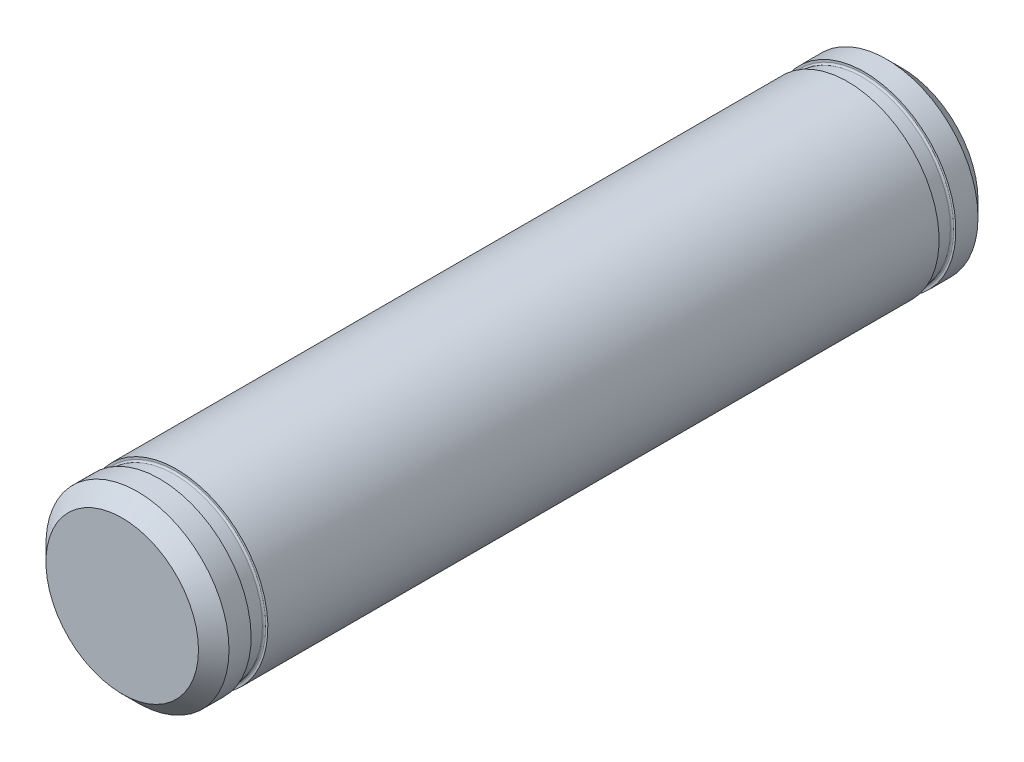
ISO-10303-21;
HEADER;
FILE_DESCRIPTION(('STEP AP214'),'2;1');
FILE_NAME('part.step','',(''),(''),'','','');
FILE_SCHEMA(('AUTOMOTIVE_DESIGN { 1 0 10303 214 1 1 1 1 }'));
ENDSEC;
DATA;
#1=APPLICATION_CONTEXT('core data for automotive mechanical design processes');
#2=APPLICATION_PROTOCOL_DEFINITION('international standard','automotive_design',2000,#1);
#3=PRODUCT_CONTEXT('',#1,'mechanical');
#4=PRODUCT('Part','Part','',(#3));
#5=PRODUCT_RELATED_PRODUCT_CATEGORY('part','',(#4));
#6=PRODUCT_DEFINITION_FORMATION('','',#4);
#7=PRODUCT_DEFINITION_CONTEXT('part definition',#1,'design');
#8=PRODUCT_DEFINITION('design','',#6,#7);
#9=PRODUCT_DEFINITION_SHAPE('','',#8);
#10=(LENGTH_UNIT() NAMED_UNIT(*) SI_UNIT(.MILLI.,.METRE.));
#11=(NAMED_UNIT(*) PLANE_ANGLE_UNIT() SI_UNIT($,.RADIAN.));
#12=(NAMED_UNIT(*) SI_UNIT($,.STERADIAN.) SOLID_ANGLE_UNIT());
#13=UNCERTAINTY_MEASURE_WITH_UNIT(LENGTH_MEASURE(1.E-05),#10,'distance_accuracy_value','');
#14=(GEOMETRIC_REPRESENTATION_CONTEXT(3) GLOBAL_UNCERTAINTY_ASSIGNED_CONTEXT((#13)) GLOBAL_UNIT_ASSIGNED_CONTEXT((#10,
#11,#12)) REPRESENTATION_CONTEXT('',''));
#15=CARTESIAN_POINT('',(0.,0.,0.));
#16=DIRECTION('',(0.,0.,1.));
#17=DIRECTION('',(1.,0.,0.));
#18=AXIS2_PLACEMENT_3D('',#15,#16,#17);
#19=CARTESIAN_POINT('',(0.,0.,51.1));
#20=DIRECTION('',(0.,0.,-1.));
#21=DIRECTION('',(-1.,0.,0.));
#22=AXIS2_PLACEMENT_3D('',#19,#20,#21);
#23=CYLINDRICAL_SURFACE('',#22,6.);
#24=CARTESIAN_POINT('',(0.,0.,47.55));
#25=DIRECTION('',(0.,0.,-1.));
#26=DIRECTION('',(0.,1.,0.));
#27=AXIS2_PLACEMENT_3D('',#24,#25,#26);
#28=CIRCLE('',#27,5.99999999999998);
#29=CARTESIAN_POINT('',(0.,5.99999999999998,47.55));
#30=VERTEX_POINT('',#29);
#31=EDGE_CURVE('E71',#30,#30,#28,.T.);
#32=ORIENTED_EDGE('',*,*,#31,.T.);
#33=EDGE_LOOP('',(#32));
#34=FACE_BOUND('',#33,.T.);
#35=CARTESIAN_POINT('',(0.,0.,3.55));
#36=DIRECTION('',(0.,0.,-1.));
#37=DIRECTION('',(-1.,0.,0.));
#38=AXIS2_PLACEMENT_3D('',#35,#36,#37);
#39=CIRCLE('',#38,6.00000000000002);
#40=CARTESIAN_POINT('',(-6.00000000000001,0.,3.54999999999999));
#41=VERTEX_POINT('',#40);
#42=EDGE_CURVE('E74',#41,#41,#39,.T.);
#43=ORIENTED_EDGE('',*,*,#42,.F.);
#44=EDGE_LOOP('',(#43));
#45=FACE_BOUND('',#44,.T.);
#46=ADVANCED_FACE('F36',(#34,#45),#23,.T.);
#47=CARTESIAN_POINT('',(0.,0.,50.1));
#48=DIRECTION('',(0.,0.,1.));
#49=DIRECTION('',(1.,0.,0.));
#50=AXIS2_PLACEMENT_3D('',#47,#48,#49);
#51=CIRCLE('',#50,6.);
#52=CARTESIAN_POINT('',(6.,0.,50.1));
#53=VERTEX_POINT('',#52);
#54=EDGE_CURVE('E51',#53,#53,#51,.F.);
#55=ORIENTED_EDGE('',*,*,#54,.T.);
#56=EDGE_LOOP('',(#55));
#57=FACE_BOUND('',#56,.T.);
#58=CARTESIAN_POINT('',(0.,0.,48.65));
#59=DIRECTION('',(0.,0.,-1.));
#60=DIRECTION('',(0.,1.,0.));
#61=AXIS2_PLACEMENT_3D('',#58,#59,#60);
#62=CIRCLE('',#61,5.99999999999999);
#63=CARTESIAN_POINT('',(0.,5.99999999999999,48.65));
#64=VERTEX_POINT('',#63);
#65=EDGE_CURVE('E56',#64,#64,#62,.T.);
#66=ORIENTED_EDGE('',*,*,#65,.F.);
#67=EDGE_LOOP('',(#66));
#68=FACE_BOUND('',#67,.T.);
#69=ADVANCED_FACE('F111',(#57,#68),#23,.T.);
#70=CARTESIAN_POINT('',(0.,0.,51.1));
#71=DIRECTION('',(0.,0.,1.));
#72=DIRECTION('',(1.,0.,0.));
#73=AXIS2_PLACEMENT_3D('',#70,#71,#72);
#74=PLANE('',#73);
#75=CARTESIAN_POINT('',(0.,0.,51.1));
#76=DIRECTION('',(0.,0.,1.));
#77=DIRECTION('',(1.,0.,0.));
#78=AXIS2_PLACEMENT_3D('',#75,#76,#77);
#79=CIRCLE('',#78,5.);
#80=CARTESIAN_POINT('',(5.,0.,51.1));
#81=VERTEX_POINT('',#80);
#82=EDGE_CURVE('E10',#81,#81,#79,.T.);
#83=ORIENTED_EDGE('',*,*,#82,.T.);
#84=EDGE_LOOP('',(#83));
#85=FACE_BOUND('',#84,.T.);
#86=ADVANCED_FACE('F117',(#85),#74,.T.);
#87=CARTESIAN_POINT('',(0.,0.,51.1));
#88=DIRECTION('',(0.,0.,-1.));
#89=DIRECTION('',(-1.,0.,0.));
#90=AXIS2_PLACEMENT_3D('',#87,#88,#89);
#91=CONICAL_SURFACE('',#90,5.,0.785398163397446);
#92=ORIENTED_EDGE('',*,*,#54,.F.);
#93=EDGE_LOOP('',(#92));
#94=FACE_BOUND('',#93,.T.);
#95=ORIENTED_EDGE('',*,*,#82,.F.);
#96=EDGE_LOOP('',(#95));
#97=FACE_BOUND('',#96,.T.);
#98=ADVANCED_FACE('F38',(#94,#97),#91,.T.);
#99=CARTESIAN_POINT('',(-5.78895240862005,-0.909741727487482,48.65));
#100=DIRECTION('',(0.,0.,-1.));
#101=DIRECTION('',(0.,1.,0.));
#102=AXIS2_PLACEMENT_3D('',#99,#100,#101);
#103=PLANE('',#102);
#104=ORIENTED_EDGE('',*,*,#65,.T.);
#105=EDGE_LOOP('',(#104));
#106=FACE_BOUND('',#105,.T.);
#107=CARTESIAN_POINT('',(0.,0.,48.65));
#108=DIRECTION('',(0.,0.,-1.));
#109=DIRECTION('',(0.,1.,0.));
#110=AXIS2_PLACEMENT_3D('',#107,#108,#109);
#111=CIRCLE('',#110,5.85999999999999);
#112=CARTESIAN_POINT('',(0.,5.85999999999999,48.65));
#113=VERTEX_POINT('',#112);
#114=EDGE_CURVE('E59',#113,#113,#111,.T.);
#115=ORIENTED_EDGE('',*,*,#114,.F.);
#116=EDGE_LOOP('',(#115));
#117=FACE_BOUND('',#116,.T.);
#118=ADVANCED_FACE('F152',(#106,#117),#103,.T.);
#119=CARTESIAN_POINT('',(0.,0.,48.54));
#120=DIRECTION('',(0.,0.,-1.));
#121=DIRECTION('',(0.,1.,0.));
#122=AXIS2_PLACEMENT_3D('',#119,#120,#121);
#123=TOROIDAL_SURFACE('',#122,5.85999999999999,0.110000000000002);
#124=ORIENTED_EDGE('',*,*,#114,.T.);
#125=EDGE_LOOP('',(#124));
#126=FACE_BOUND('',#125,.T.);
#127=CARTESIAN_POINT('',(0.,0.,48.54));
#128=DIRECTION('',(0.,0.,-1.));
#129=DIRECTION('',(0.,1.,0.));
#130=AXIS2_PLACEMENT_3D('',#127,#128,#129);
#131=CIRCLE('',#130,5.74999999999999);
#132=CARTESIAN_POINT('',(0.,5.74999999999999,48.54));
#133=VERTEX_POINT('',#132);
#134=EDGE_CURVE('E62',#133,#133,#131,.T.);
#135=ORIENTED_EDGE('',*,*,#134,.F.);
#136=EDGE_LOOP('',(#135));
#137=FACE_BOUND('',#136,.T.);
#138=ADVANCED_FACE('F159',(#126,#137),#123,.F.);
#139=CARTESIAN_POINT('',(0.,0.,39.3171342609856));
#140=DIRECTION('',(0.,0.,-1.));
#141=DIRECTION('',(0.,1.,0.));
#142=AXIS2_PLACEMENT_3D('',#139,#140,#141);
#143=CYLINDRICAL_SURFACE('',#142,5.74999999999999);
#144=ORIENTED_EDGE('',*,*,#134,.T.);
#145=EDGE_LOOP('',(#144));
#146=FACE_BOUND('',#145,.T.);
#147=CARTESIAN_POINT('',(0.,0.,47.66));
#148=DIRECTION('',(0.,0.,-1.));
#149=DIRECTION('',(0.,1.,0.));
#150=AXIS2_PLACEMENT_3D('',#147,#148,#149);
#151=CIRCLE('',#150,5.74999999999999);
#152=CARTESIAN_POINT('',(0.,5.74999999999998,47.66));
#153=VERTEX_POINT('',#152);
#154=EDGE_CURVE('E65',#153,#153,#151,.T.);
#155=ORIENTED_EDGE('',*,*,#154,.F.);
#156=EDGE_LOOP('',(#155));
#157=FACE_BOUND('',#156,.T.);
#158=ADVANCED_FACE('F168',(#146,#157),#143,.T.);
#159=CARTESIAN_POINT('',(0.,0.,47.66));
#160=DIRECTION('',(0.,0.,-1.));
#161=DIRECTION('',(0.,1.,0.));
#162=AXIS2_PLACEMENT_3D('',#159,#160,#161);
#163=TOROIDAL_SURFACE('',#162,5.85999999999999,0.109999999999998);
#164=ORIENTED_EDGE('',*,*,#154,.T.);
#165=EDGE_LOOP('',(#164));
#166=FACE_BOUND('',#165,.T.);
#167=CARTESIAN_POINT('',(0.,0.,47.55));
#168=DIRECTION('',(0.,0.,-1.));
#169=DIRECTION('',(0.,1.,0.));
#170=AXIS2_PLACEMENT_3D('',#167,#168,#169);
#171=CIRCLE('',#170,5.85999999999999);
#172=CARTESIAN_POINT('',(0.,5.85999999999998,47.55));
#173=VERTEX_POINT('',#172);
#174=EDGE_CURVE('E68',#173,#173,#171,.T.);
#175=ORIENTED_EDGE('',*,*,#174,.F.);
#176=EDGE_LOOP('',(#175));
#177=FACE_BOUND('',#176,.T.);
#178=ADVANCED_FACE('F176',(#166,#177),#163,.F.);
#179=CARTESIAN_POINT('',(-5.92725502589083,-0.931476171488889,47.55));
#180=DIRECTION('',(0.,0.,1.));
#181=DIRECTION('',(0.,-1.,0.));
#182=AXIS2_PLACEMENT_3D('',#179,#180,#181);
#183=PLANE('',#182);
#184=ORIENTED_EDGE('',*,*,#174,.T.);
#185=EDGE_LOOP('',(#184));
#186=FACE_BOUND('',#185,.T.);
#187=ORIENTED_EDGE('',*,*,#31,.F.);
#188=EDGE_LOOP('',(#187));
#189=FACE_BOUND('',#188,.T.);
#190=ADVANCED_FACE('F184',(#186,#189),#183,.T.);
#191=CARTESIAN_POINT('',(-5.78895240862007,-0.90974172748748,3.54999999999999));
#192=DIRECTION('',(0.,0.,-1.));
#193=DIRECTION('',(-1.,0.,0.));
#194=AXIS2_PLACEMENT_3D('',#191,#192,#193);
#195=PLANE('',#194);
#196=ORIENTED_EDGE('',*,*,#42,.T.);
#197=EDGE_LOOP('',(#196));
#198=FACE_BOUND('',#197,.T.);
#199=CARTESIAN_POINT('',(0.,0.,3.55));
#200=DIRECTION('',(0.,0.,-1.));
#201=DIRECTION('',(-1.,0.,0.));
#202=AXIS2_PLACEMENT_3D('',#199,#200,#201);
#203=CIRCLE('',#202,5.86000000000002);
#204=CARTESIAN_POINT('',(-5.86,0.,3.54999999999999));
#205=VERTEX_POINT('',#204);
#206=EDGE_CURVE('E77',#205,#205,#203,.T.);
#207=ORIENTED_EDGE('',*,*,#206,.F.);
#208=EDGE_LOOP('',(#207));
#209=FACE_BOUND('',#208,.T.);
#210=ADVANCED_FACE('F192',(#198,#209),#195,.T.);
#211=CARTESIAN_POINT('',(0.,0.,3.44));
#212=DIRECTION('',(0.,0.,-1.));
#213=DIRECTION('',(-1.,0.,0.));
#214=AXIS2_PLACEMENT_3D('',#211,#212,#213);
#215=TOROIDAL_SURFACE('',#214,5.86000000000002,0.109999999999998);
#216=ORIENTED_EDGE('',*,*,#206,.T.);
#217=EDGE_LOOP('',(#216));
#218=FACE_BOUND('',#217,.T.);
#219=CARTESIAN_POINT('',(0.,0.,3.44));
#220=DIRECTION('',(0.,0.,-1.));
#221=DIRECTION('',(-1.,0.,0.));
#222=AXIS2_PLACEMENT_3D('',#219,#220,#221);
#223=CIRCLE('',#222,5.75000000000002);
#224=CARTESIAN_POINT('',(-5.75000000000001,0.,3.43999999999999));
#225=VERTEX_POINT('',#224);
#226=EDGE_CURVE('E80',#225,#225,#223,.T.);
#227=ORIENTED_EDGE('',*,*,#226,.F.);
#228=EDGE_LOOP('',(#227));
#229=FACE_BOUND('',#228,.T.);
#230=ADVANCED_FACE('F199',(#218,#229),#215,.F.);
#231=CARTESIAN_POINT('',(0.,0.,39.3171342609855));
#232=DIRECTION('',(0.,0.,-1.));
#233=DIRECTION('',(-1.,0.,0.));
#234=AXIS2_PLACEMENT_3D('',#231,#232,#233);
#235=CYLINDRICAL_SURFACE('',#234,5.75000000000002);
#236=ORIENTED_EDGE('',*,*,#226,.T.);
#237=EDGE_LOOP('',(#236));
#238=FACE_BOUND('',#237,.T.);
#239=CARTESIAN_POINT('',(0.,0.,2.55999999999999));
#240=DIRECTION('',(0.,0.,-1.));
#241=DIRECTION('',(-1.,0.,0.));
#242=AXIS2_PLACEMENT_3D('',#239,#240,#241);
#243=CIRCLE('',#242,5.75000000000002);
#244=CARTESIAN_POINT('',(-5.75000000000001,0.,2.55999999999999));
#245=VERTEX_POINT('',#244);
#246=EDGE_CURVE('E83',#245,#245,#243,.T.);
#247=ORIENTED_EDGE('',*,*,#246,.F.);
#248=EDGE_LOOP('',(#247));
#249=FACE_BOUND('',#248,.T.);
#250=ADVANCED_FACE('F107',(#238,#249),#235,.T.);
#251=CARTESIAN_POINT('',(0.,0.,2.55999999999999));
#252=DIRECTION('',(0.,0.,-1.));
#253=DIRECTION('',(-1.,0.,0.));
#254=AXIS2_PLACEMENT_3D('',#251,#252,#253);
#255=TOROIDAL_SURFACE('',#254,5.86000000000002,0.109999999999998);
#256=ORIENTED_EDGE('',*,*,#246,.T.);
#257=EDGE_LOOP('',(#256));
#258=FACE_BOUND('',#257,.T.);
#259=CARTESIAN_POINT('',(0.,0.,2.44999999999999));
#260=DIRECTION('',(0.,0.,-1.));
#261=DIRECTION('',(-1.,0.,0.));
#262=AXIS2_PLACEMENT_3D('',#259,#260,#261);
#263=CIRCLE('',#262,5.86000000000002);
#264=CARTESIAN_POINT('',(-5.86,0.,2.44999999999999));
#265=VERTEX_POINT('',#264);
#266=EDGE_CURVE('E86',#265,#265,#263,.T.);
#267=ORIENTED_EDGE('',*,*,#266,.F.);
#268=EDGE_LOOP('',(#267));
#269=FACE_BOUND('',#268,.T.);
#270=ADVANCED_FACE('F98',(#258,#269),#255,.F.);
#271=CARTESIAN_POINT('',(-5.92725502589086,-0.931476171488887,2.44999999999999));
#272=DIRECTION('',(0.,0.,1.));
#273=DIRECTION('',(1.,0.,0.));
#274=AXIS2_PLACEMENT_3D('',#271,#272,#273);
#275=PLANE('',#274);
#276=ORIENTED_EDGE('',*,*,#266,.T.);
#277=EDGE_LOOP('',(#276));
#278=FACE_BOUND('',#277,.T.);
#279=CARTESIAN_POINT('',(0.,0.,2.44999999999999));
#280=DIRECTION('',(0.,0.,-1.));
#281=DIRECTION('',(-1.,0.,0.));
#282=AXIS2_PLACEMENT_3D('',#279,#280,#281);
#283=CIRCLE('',#282,6.00000000000002);
#284=CARTESIAN_POINT('',(-6.,0.,2.44999999999999));
#285=VERTEX_POINT('',#284);
#286=EDGE_CURVE('E89',#285,#285,#283,.T.);
#287=ORIENTED_EDGE('',*,*,#286,.F.);
#288=EDGE_LOOP('',(#287));
#289=FACE_BOUND('',#288,.T.);
#290=ADVANCED_FACE('F95',(#278,#289),#275,.T.);
#291=CARTESIAN_POINT('',(0.,0.,0.));
#292=DIRECTION('',(0.,0.,1.));
#293=DIRECTION('',(1.,0.,0.));
#294=AXIS2_PLACEMENT_3D('',#291,#292,#293);
#295=PLANE('',#294);
#296=CARTESIAN_POINT('',(0.,0.,0.));
#297=DIRECTION('',(0.,0.,1.));
#298=DIRECTION('',(1.,0.,0.));
#299=AXIS2_PLACEMENT_3D('',#296,#297,#298);
#300=CIRCLE('',#299,4.99999999999998);
#301=CARTESIAN_POINT('',(4.99999999999998,0.,0.));
#302=VERTEX_POINT('',#301);
#303=EDGE_CURVE('E43',#302,#302,#300,.F.);
#304=ORIENTED_EDGE('',*,*,#303,.T.);
#305=EDGE_LOOP('',(#304));
#306=FACE_BOUND('',#305,.T.);
#307=ADVANCED_FACE('F97',(#306),#295,.F.);
#308=CARTESIAN_POINT('',(0.,0.,1.00000000000002));
#309=DIRECTION('',(0.,0.,1.));
#310=DIRECTION('',(1.,0.,0.));
#311=AXIS2_PLACEMENT_3D('',#308,#309,#310);
#312=CONICAL_SURFACE('',#311,6.,0.785398163397449);
#313=ORIENTED_EDGE('',*,*,#303,.F.);
#314=EDGE_LOOP('',(#313));
#315=FACE_BOUND('',#314,.T.);
#316=CARTESIAN_POINT('',(0.,0.,1.00000000000002));
#317=DIRECTION('',(0.,0.,1.));
#318=DIRECTION('',(1.,0.,0.));
#319=AXIS2_PLACEMENT_3D('',#316,#317,#318);
#320=CIRCLE('',#319,6.);
#321=CARTESIAN_POINT('',(6.,0.,1.00000000000002));
#322=VERTEX_POINT('',#321);
#323=EDGE_CURVE('E47',#322,#322,#320,.T.);
#324=ORIENTED_EDGE('',*,*,#323,.F.);
#325=EDGE_LOOP('',(#324));
#326=FACE_BOUND('',#325,.T.);
#327=ADVANCED_FACE('F105',(#315,#326),#312,.T.);
#328=ORIENTED_EDGE('',*,*,#323,.T.);
#329=EDGE_LOOP('',(#328));
#330=FACE_BOUND('',#329,.T.);
#331=ORIENTED_EDGE('',*,*,#286,.T.);
#332=EDGE_LOOP('',(#331));
#333=FACE_BOUND('',#332,.T.);
#334=ADVANCED_FACE('F93',(#330,#333),#23,.T.);
#335=CLOSED_SHELL('',(#46,#69,#86,#98,#118,#138,#158,#178,#190,#210,#230,#250,#270,#290,#307,
#327,#334));
#336=MANIFOLD_SOLID_BREP('B2',#335);
#337=ADVANCED_BREP_SHAPE_REPRESENTATION('',(#18,#336),#14);
#338=SHAPE_DEFINITION_REPRESENTATION(#9,#337);
ENDSEC;
END-ISO-10303-21;
